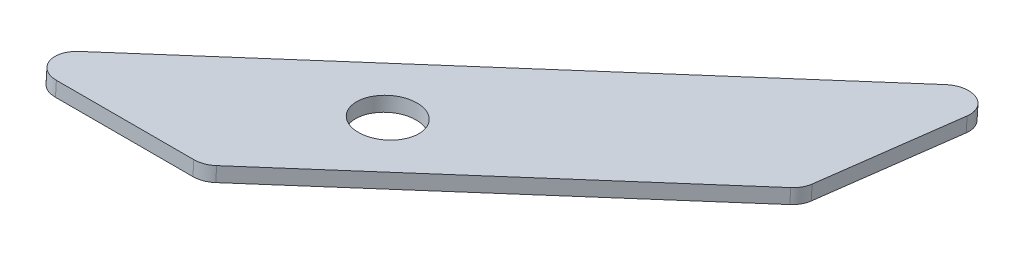
ISO-10303-21;
HEADER;
FILE_DESCRIPTION(('STEP AP214'),'2;1');
FILE_NAME('part.step','',(''),(''),'','','');
FILE_SCHEMA(('AUTOMOTIVE_DESIGN { 1 0 10303 214 1 1 1 1 }'));
ENDSEC;
DATA;
#1=APPLICATION_CONTEXT('core data for automotive mechanical design processes');
#2=APPLICATION_PROTOCOL_DEFINITION('international standard','automotive_design',2000,#1);
#3=PRODUCT_CONTEXT('',#1,'mechanical');
#4=PRODUCT('Part','Part','',(#3));
#5=PRODUCT_RELATED_PRODUCT_CATEGORY('part','',(#4));
#6=PRODUCT_DEFINITION_FORMATION('','',#4);
#7=PRODUCT_DEFINITION_CONTEXT('part definition',#1,'design');
#8=PRODUCT_DEFINITION('design','',#6,#7);
#9=PRODUCT_DEFINITION_SHAPE('','',#8);
#10=(LENGTH_UNIT() NAMED_UNIT(*) SI_UNIT(.MILLI.,.METRE.));
#11=(NAMED_UNIT(*) PLANE_ANGLE_UNIT() SI_UNIT($,.RADIAN.));
#12=(NAMED_UNIT(*) SI_UNIT($,.STERADIAN.) SOLID_ANGLE_UNIT());
#13=UNCERTAINTY_MEASURE_WITH_UNIT(LENGTH_MEASURE(1.E-05),#10,'distance_accuracy_value','');
#14=(GEOMETRIC_REPRESENTATION_CONTEXT(3) GLOBAL_UNCERTAINTY_ASSIGNED_CONTEXT((#13)) GLOBAL_UNIT_ASSIGNED_CONTEXT((#10,
#11,#12)) REPRESENTATION_CONTEXT('',''));
#15=CARTESIAN_POINT('',(0.,0.,0.));
#16=DIRECTION('',(0.,0.,1.));
#17=DIRECTION('',(1.,0.,0.));
#18=AXIS2_PLACEMENT_3D('',#15,#16,#17);
#19=CARTESIAN_POINT('',(0.,39.1342615246011,-2.55582718350822));
#20=DIRECTION('',(0.,-0.997874152520213,0.0651703593059531));
#21=DIRECTION('',(0.,-0.0651703593059531,-0.997874152520213));
#22=AXIS2_PLACEMENT_3D('',#19,#20,#21);
#23=PLANE('',#22);
#24=DIRECTION('',(0.707106781186552,-0.0460824029976039,-0.705603580017817));
#25=VECTOR('',#24,1.);
#26=CARTESIAN_POINT('',(115.342911463774,132.560980983489,1427.9734731861));
#27=LINE('',#26,#25);
#28=CARTESIAN_POINT('',(119.678962687988,132.278398967238,1423.64663974545));
#29=VERTEX_POINT('',#28);
#30=CARTESIAN_POINT('',(167.859919045252,129.13842872973,1375.56810875284));
#31=VERTEX_POINT('',#30);
#32=EDGE_CURVE('E143',#29,#31,#27,.T.);
#33=ORIENTED_EDGE('',*,*,#32,.T.);
#34=CARTESIAN_POINT('',(169.655970269466,129.255478033344,1377.36034184608));
#35=DIRECTION('',(0.,-0.997874152520213,0.0651703593059531));
#36=DIRECTION('',(0.,-0.0651703593059531,-0.997874152520213));
#37=AXIS2_PLACEMENT_3D('',#34,#35,#36);
#38=CIRCLE('',#37,2.54);
#39=CARTESIAN_POINT('',(172.191244955838,129.265570450912,1377.51487471555));
#40=VERTEX_POINT('',#39);
#41=EDGE_CURVE('E161',#31,#40,#38,.T.);
#42=ORIENTED_EDGE('',*,*,#41,.T.);
#43=DIRECTION('',(-0.0609693238726651,0.0650491189961366,0.99601774766534));
#44=VECTOR('',#43,1.);
#45=CARTESIAN_POINT('',(172.59994748384,128.829519373267,1370.83815689176));
#46=LINE('',#45,#44);
#47=CARTESIAN_POINT('',(171.198059162052,130.325215806669,1393.73993044041));
#48=VERTEX_POINT('',#47);
#49=EDGE_CURVE('E125',#40,#48,#46,.T.);
#50=ORIENTED_EDGE('',*,*,#49,.T.);
#51=CARTESIAN_POINT('',(168.662784475679,130.315123389101,1393.58539757094));
#52=DIRECTION('',(0.,-0.997874152520213,0.0651703593059531));
#53=DIRECTION('',(0.,-0.0651703593059531,-0.997874152520213));
#54=AXIS2_PLACEMENT_3D('',#51,#52,#53);
#55=CIRCLE('',#54,2.54);
#56=CARTESIAN_POINT('',(170.458835699893,130.432172692715,1395.37763066418));
#57=VERTEX_POINT('',#56);
#58=EDGE_CURVE('E158',#48,#57,#55,.T.);
#59=ORIENTED_EDGE('',*,*,#58,.T.);
#60=DIRECTION('',(-0.70710678118655,0.0460824029976047,0.705603580017819));
#61=VECTOR('',#60,1.);
#62=CARTESIAN_POINT('',(171.139380140036,130.387821367027,1394.69853295772));
#63=LINE('',#62,#61);
#64=CARTESIAN_POINT('',(138.537500542234,132.512497574465,1427.23110593194));
#65=VERTEX_POINT('',#64);
#66=EDGE_CURVE('E172',#57,#65,#63,.T.);
#67=ORIENTED_EDGE('',*,*,#66,.T.);
#68=CARTESIAN_POINT('',(136.74144931802,132.395448270851,1425.4388728387));
#69=DIRECTION('',(0.,-0.997874152520213,0.0651703593059531));
#70=DIRECTION('',(0.,-0.0651703593059531,-0.997874152520213));
#71=AXIS2_PLACEMENT_3D('',#68,#69,#70);
#72=CIRCLE('',#71,2.54);
#73=CARTESIAN_POINT('',(136.74144931802,132.560980983489,1427.9734731861));
#74=VERTEX_POINT('',#73);
#75=EDGE_CURVE('E61',#65,#74,#72,.T.);
#76=ORIENTED_EDGE('',*,*,#75,.T.);
#77=DIRECTION('',(-1.,0.,0.));
#78=VECTOR('',#77,1.);
#79=CARTESIAN_POINT('',(137.793551766447,132.560980983489,1427.9734731861));
#80=LINE('',#79,#78);
#81=CARTESIAN_POINT('',(121.475013912202,132.560980983489,1427.9734731861));
#82=VERTEX_POINT('',#81);
#83=EDGE_CURVE('E180',#74,#82,#80,.T.);
#84=ORIENTED_EDGE('',*,*,#83,.T.);
#85=CARTESIAN_POINT('',(121.475013912202,132.395448270851,1425.4388728387));
#86=DIRECTION('',(0.,-0.997874152520213,0.0651703593059531));
#87=DIRECTION('',(0.,-0.0651703593059531,-0.997874152520213));
#88=AXIS2_PLACEMENT_3D('',#85,#86,#87);
#89=CIRCLE('',#88,2.54);
#90=EDGE_CURVE('E156',#82,#29,#89,.T.);
#91=ORIENTED_EDGE('',*,*,#90,.T.);
#92=EDGE_LOOP('',(#33,#42,#50,#59,#67,#76,#84,#91));
#93=FACE_BOUND('',#92,.T.);
#94=CARTESIAN_POINT('',(142.443231615111,131.526401529507,1412.13222101484));
#95=DIRECTION('',(0.,-0.997874152520213,0.0651703593059542));
#96=DIRECTION('',(0.,-0.0651703593059542,-0.997874152520213));
#97=AXIS2_PLACEMENT_3D('',#94,#95,#96);
#98=CIRCLE('',#97,3.26389999999984);
#99=CARTESIAN_POINT('',(142.443231615111,131.313691993768,1408.87525956843));
#100=VERTEX_POINT('',#99);
#101=EDGE_CURVE('E134',#100,#100,#98,.T.);
#102=ORIENTED_EDGE('',*,*,#101,.F.);
#103=EDGE_LOOP('',(#102));
#104=FACE_BOUND('',#103,.T.);
#105=ADVANCED_FACE('F39',(#93,#104),#23,.T.);
#106=CARTESIAN_POINT('',(0.,40.7183867417269,-2.65928512890642));
#107=DIRECTION('',(0.,-0.997874152520213,0.0651703593059531));
#108=DIRECTION('',(0.,-0.0651703593059531,-0.997874152520213));
#109=AXIS2_PLACEMENT_3D('',#106,#107,#108);
#110=PLANE('',#109);
#111=DIRECTION('',(-0.0609693238726651,0.0650491189961366,0.99601774766534));
#112=VECTOR('',#111,1.);
#113=CARTESIAN_POINT('',(172.59994748384,130.413644590393,1370.73469894636));
#114=LINE('',#113,#112);
#115=CARTESIAN_POINT('',(172.191244955838,130.849695668038,1377.41141677015));
#116=VERTEX_POINT('',#115);
#117=CARTESIAN_POINT('',(171.198059162052,131.909341023795,1393.63647249501));
#118=VERTEX_POINT('',#117);
#119=EDGE_CURVE('E122',#116,#118,#114,.T.);
#120=ORIENTED_EDGE('',*,*,#119,.F.);
#121=CARTESIAN_POINT('',(169.655970269466,130.83960325047,1377.25688390068));
#122=DIRECTION('',(0.,-0.997874152520213,0.0651703593059531));
#123=DIRECTION('',(0.,-0.0651703593059531,-0.997874152520213));
#124=AXIS2_PLACEMENT_3D('',#121,#122,#123);
#125=CIRCLE('',#124,2.54);
#126=CARTESIAN_POINT('',(167.859919045252,130.722553946856,1375.46465080744));
#127=VERTEX_POINT('',#126);
#128=EDGE_CURVE('E105',#116,#127,#125,.F.);
#129=ORIENTED_EDGE('',*,*,#128,.T.);
#130=DIRECTION('',(0.707106781186552,-0.0460824029976039,-0.705603580017817));
#131=VECTOR('',#130,1.);
#132=CARTESIAN_POINT('',(115.342911463774,134.145106200614,1427.8700152407));
#133=LINE('',#132,#131);
#134=CARTESIAN_POINT('',(119.678962687988,133.862524184363,1423.54318180006));
#135=VERTEX_POINT('',#134);
#136=EDGE_CURVE('E147',#135,#127,#133,.T.);
#137=ORIENTED_EDGE('',*,*,#136,.F.);
#138=CARTESIAN_POINT('',(121.475013912202,133.979573487977,1425.3354148933));
#139=DIRECTION('',(0.,-0.997874152520213,0.0651703593059531));
#140=DIRECTION('',(0.,-0.0651703593059531,-0.997874152520213));
#141=AXIS2_PLACEMENT_3D('',#138,#139,#140);
#142=CIRCLE('',#141,2.54);
#143=CARTESIAN_POINT('',(121.475013912202,134.145106200614,1427.8700152407));
#144=VERTEX_POINT('',#143);
#145=EDGE_CURVE('E126',#135,#144,#142,.F.);
#146=ORIENTED_EDGE('',*,*,#145,.T.);
#147=DIRECTION('',(-1.,0.,0.));
#148=VECTOR('',#147,1.);
#149=CARTESIAN_POINT('',(137.793551766447,134.145106200614,1427.8700152407));
#150=LINE('',#149,#148);
#151=CARTESIAN_POINT('',(136.74144931802,134.145106200614,1427.8700152407));
#152=VERTEX_POINT('',#151);
#153=EDGE_CURVE('E137',#152,#144,#150,.T.);
#154=ORIENTED_EDGE('',*,*,#153,.F.);
#155=CARTESIAN_POINT('',(136.74144931802,133.979573487977,1425.3354148933));
#156=DIRECTION('',(0.,-0.997874152520213,0.0651703593059531));
#157=DIRECTION('',(0.,-0.0651703593059531,-0.997874152520213));
#158=AXIS2_PLACEMENT_3D('',#155,#156,#157);
#159=CIRCLE('',#158,2.54);
#160=CARTESIAN_POINT('',(138.537500542234,134.096622791591,1427.12764798655));
#161=VERTEX_POINT('',#160);
#162=EDGE_CURVE('E116',#152,#161,#159,.F.);
#163=ORIENTED_EDGE('',*,*,#162,.T.);
#164=DIRECTION('',(-0.70710678118655,0.0460824029976047,0.705603580017819));
#165=VECTOR('',#164,1.);
#166=CARTESIAN_POINT('',(171.139380140036,131.971946584153,1394.59507501232));
#167=LINE('',#166,#165);
#168=CARTESIAN_POINT('',(170.458835699893,132.016297909841,1395.27417271878));
#169=VERTEX_POINT('',#168);
#170=EDGE_CURVE('E133',#169,#161,#167,.T.);
#171=ORIENTED_EDGE('',*,*,#170,.F.);
#172=CARTESIAN_POINT('',(168.662784475679,131.899248606227,1393.48193962554));
#173=DIRECTION('',(0.,-0.997874152520213,0.0651703593059531));
#174=DIRECTION('',(0.,-0.0651703593059531,-0.997874152520213));
#175=AXIS2_PLACEMENT_3D('',#172,#173,#174);
#176=CIRCLE('',#175,2.54);
#177=EDGE_CURVE('E132',#169,#118,#176,.F.);
#178=ORIENTED_EDGE('',*,*,#177,.T.);
#179=EDGE_LOOP('',(#120,#129,#137,#146,#154,#163,#171,#178));
#180=FACE_BOUND('',#179,.T.);
#181=CARTESIAN_POINT('',(142.443231615111,133.110526746632,1412.02876306944));
#182=DIRECTION('',(0.,-0.997874152520213,0.0651703593059542));
#183=DIRECTION('',(0.,-0.0651703593059542,-0.997874152520213));
#184=AXIS2_PLACEMENT_3D('',#181,#182,#183);
#185=CIRCLE('',#184,3.26389999999984);
#186=CARTESIAN_POINT('',(142.443231615111,132.897817210894,1408.77180162303));
#187=VERTEX_POINT('',#186);
#188=EDGE_CURVE('E140',#187,#187,#185,.T.);
#189=ORIENTED_EDGE('',*,*,#188,.T.);
#190=EDGE_LOOP('',(#189));
#191=FACE_BOUND('',#190,.T.);
#192=ADVANCED_FACE('F129',(#180,#191),#110,.F.);
#193=CARTESIAN_POINT('',(172.59994748384,128.829519373267,1370.83815689176));
#194=DIRECTION('',(-0.998139640304156,-0.00397339274342267,-0.060839712389166));
#195=DIRECTION('',(-0.0608401926589762,0.,0.998147519636861));
#196=AXIS2_PLACEMENT_3D('',#193,#194,#195);
#197=PLANE('',#196);
#198=ORIENTED_EDGE('',*,*,#49,.F.);
#199=DIRECTION('',(0.,0.997874152520213,-0.0651703593059542));
#200=VECTOR('',#199,1.);
#201=CARTESIAN_POINT('',(172.191244955838,129.265570450912,1377.51487471555));
#202=LINE('',#201,#200);
#203=EDGE_CURVE('E109',#40,#116,#202,.T.);
#204=ORIENTED_EDGE('',*,*,#203,.T.);
#205=ORIENTED_EDGE('',*,*,#119,.T.);
#206=DIRECTION('',(0.,0.997874152520213,-0.0651703593059542));
#207=VECTOR('',#206,1.);
#208=CARTESIAN_POINT('',(171.198059162052,130.325215806669,1393.73993044041));
#209=LINE('',#208,#207);
#210=EDGE_CURVE('E127',#118,#48,#209,.F.);
#211=ORIENTED_EDGE('',*,*,#210,.T.);
#212=EDGE_LOOP('',(#198,#204,#205,#211));
#213=FACE_BOUND('',#212,.T.);
#214=ADVANCED_FACE('F121',(#213),#197,.F.);
#215=CARTESIAN_POINT('',(171.139380140036,130.387821367027,1394.69853295772));
#216=DIRECTION('',(-0.707106781186545,-0.0460824029976042,-0.705603580017824));
#217=DIRECTION('',(-0.706353980986723,0.,0.70785878079191));
#218=AXIS2_PLACEMENT_3D('',#215,#216,#217);
#219=PLANE('',#218);
#220=ORIENTED_EDGE('',*,*,#170,.T.);
#221=DIRECTION('',(0.,0.997874152520213,-0.0651703593059542));
#222=VECTOR('',#221,1.);
#223=CARTESIAN_POINT('',(138.537500542234,132.512497574465,1427.23110593194));
#224=LINE('',#223,#222);
#225=EDGE_CURVE('E11',#161,#65,#224,.F.);
#226=ORIENTED_EDGE('',*,*,#225,.T.);
#227=ORIENTED_EDGE('',*,*,#66,.F.);
#228=DIRECTION('',(0.,0.997874152520213,-0.0651703593059542));
#229=VECTOR('',#228,1.);
#230=CARTESIAN_POINT('',(170.458835699893,130.432172692715,1395.37763066418));
#231=LINE('',#230,#229);
#232=EDGE_CURVE('E47',#57,#169,#231,.T.);
#233=ORIENTED_EDGE('',*,*,#232,.T.);
#234=EDGE_LOOP('',(#220,#226,#227,#233));
#235=FACE_BOUND('',#234,.T.);
#236=ADVANCED_FACE('F170',(#235),#219,.F.);
#237=CARTESIAN_POINT('',(137.793551766447,132.560980983489,1427.9734731861));
#238=DIRECTION('',(0.,-0.0651703593059542,-0.997874152520213));
#239=DIRECTION('',(0.,0.997874152520213,-0.0651703593059542));
#240=AXIS2_PLACEMENT_3D('',#237,#238,#239);
#241=PLANE('',#240);
#242=ORIENTED_EDGE('',*,*,#83,.F.);
#243=DIRECTION('',(0.,0.997874152520213,-0.0651703593059542));
#244=VECTOR('',#243,1.);
#245=CARTESIAN_POINT('',(136.74144931802,132.560980983489,1427.9734731861));
#246=LINE('',#245,#244);
#247=EDGE_CURVE('E164',#74,#152,#246,.T.);
#248=ORIENTED_EDGE('',*,*,#247,.T.);
#249=ORIENTED_EDGE('',*,*,#153,.T.);
#250=DIRECTION('',(0.,0.997874152520213,-0.0651703593059542));
#251=VECTOR('',#250,1.);
#252=CARTESIAN_POINT('',(121.475013912202,132.560980983489,1427.9734731861));
#253=LINE('',#252,#251);
#254=EDGE_CURVE('E54',#144,#82,#253,.F.);
#255=ORIENTED_EDGE('',*,*,#254,.T.);
#256=EDGE_LOOP('',(#242,#248,#249,#255));
#257=FACE_BOUND('',#256,.T.);
#258=ADVANCED_FACE('F179',(#257),#241,.F.);
#259=CARTESIAN_POINT('',(115.342911463774,132.560980983489,1427.9734731861));
#260=DIRECTION('',(0.707106781186543,0.0460824029976043,0.705603580017826));
#261=DIRECTION('',(0.706353980986725,0.,-0.707858780791907));
#262=AXIS2_PLACEMENT_3D('',#259,#260,#261);
#263=PLANE('',#262);
#264=ORIENTED_EDGE('',*,*,#136,.T.);
#265=DIRECTION('',(0.,0.997874152520213,-0.0651703593059542));
#266=VECTOR('',#265,1.);
#267=CARTESIAN_POINT('',(167.859919045252,129.13842872973,1375.56810875284));
#268=LINE('',#267,#266);
#269=EDGE_CURVE('E110',#127,#31,#268,.F.);
#270=ORIENTED_EDGE('',*,*,#269,.T.);
#271=ORIENTED_EDGE('',*,*,#32,.F.);
#272=DIRECTION('',(0.,0.997874152520213,-0.0651703593059542));
#273=VECTOR('',#272,1.);
#274=CARTESIAN_POINT('',(119.678962687988,132.278398967238,1423.64663974545));
#275=LINE('',#274,#273);
#276=EDGE_CURVE('E115',#29,#135,#275,.T.);
#277=ORIENTED_EDGE('',*,*,#276,.T.);
#278=EDGE_LOOP('',(#264,#270,#271,#277));
#279=FACE_BOUND('',#278,.T.);
#280=ADVANCED_FACE('F191',(#279),#263,.F.);
#281=CARTESIAN_POINT('',(142.443231615111,131.526401529507,1412.13222101484));
#282=DIRECTION('',(0.,0.997874152520213,-0.0651703593059542));
#283=DIRECTION('',(0.,0.0651703593059542,0.997874152520213));
#284=AXIS2_PLACEMENT_3D('',#281,#282,#283);
#285=CYLINDRICAL_SURFACE('',#284,3.26389999999984);
#286=ORIENTED_EDGE('',*,*,#101,.T.);
#287=EDGE_LOOP('',(#286));
#288=FACE_BOUND('',#287,.T.);
#289=ORIENTED_EDGE('',*,*,#188,.F.);
#290=EDGE_LOOP('',(#289));
#291=FACE_BOUND('',#290,.T.);
#292=ADVANCED_FACE('F189',(#288,#291),#285,.F.);
#293=CARTESIAN_POINT('',(169.655970269466,129.255478033344,1377.36034184608));
#294=DIRECTION('',(0.,0.997874152520213,-0.0651703593059542));
#295=DIRECTION('',(0.,0.0651703593059542,0.997874152520213));
#296=AXIS2_PLACEMENT_3D('',#293,#294,#295);
#297=CYLINDRICAL_SURFACE('',#296,2.54);
#298=ORIENTED_EDGE('',*,*,#41,.F.);
#299=ORIENTED_EDGE('',*,*,#269,.F.);
#300=ORIENTED_EDGE('',*,*,#128,.F.);
#301=ORIENTED_EDGE('',*,*,#203,.F.);
#302=EDGE_LOOP('',(#298,#299,#300,#301));
#303=FACE_BOUND('',#302,.T.);
#304=ADVANCED_FACE('F108',(#303),#297,.T.);
#305=CARTESIAN_POINT('',(136.74144931802,132.395448270851,1425.4388728387));
#306=DIRECTION('',(0.,0.997874152520213,-0.0651703593059541));
#307=DIRECTION('',(0.,0.0651703593059542,0.997874152520213));
#308=AXIS2_PLACEMENT_3D('',#305,#306,#307);
#309=CYLINDRICAL_SURFACE('',#308,2.54);
#310=ORIENTED_EDGE('',*,*,#75,.F.);
#311=ORIENTED_EDGE('',*,*,#225,.F.);
#312=ORIENTED_EDGE('',*,*,#162,.F.);
#313=ORIENTED_EDGE('',*,*,#247,.F.);
#314=EDGE_LOOP('',(#310,#311,#312,#313));
#315=FACE_BOUND('',#314,.T.);
#316=ADVANCED_FACE('F178',(#315),#309,.T.);
#317=CARTESIAN_POINT('',(168.662784475679,130.315123389101,1393.58539757094));
#318=DIRECTION('',(0.,0.997874152520213,-0.0651703593059542));
#319=DIRECTION('',(0.,0.0651703593059542,0.997874152520213));
#320=AXIS2_PLACEMENT_3D('',#317,#318,#319);
#321=CYLINDRICAL_SURFACE('',#320,2.54);
#322=ORIENTED_EDGE('',*,*,#58,.F.);
#323=ORIENTED_EDGE('',*,*,#210,.F.);
#324=ORIENTED_EDGE('',*,*,#177,.F.);
#325=ORIENTED_EDGE('',*,*,#232,.F.);
#326=EDGE_LOOP('',(#322,#323,#324,#325));
#327=FACE_BOUND('',#326,.T.);
#328=ADVANCED_FACE('F216',(#327),#321,.T.);
#329=CARTESIAN_POINT('',(121.475013912202,132.395448270851,1425.4388728387));
#330=DIRECTION('',(0.,0.997874152520213,-0.0651703593059541));
#331=DIRECTION('',(0.,0.0651703593059542,0.997874152520213));
#332=AXIS2_PLACEMENT_3D('',#329,#330,#331);
#333=CYLINDRICAL_SURFACE('',#332,2.54);
#334=ORIENTED_EDGE('',*,*,#90,.F.);
#335=ORIENTED_EDGE('',*,*,#254,.F.);
#336=ORIENTED_EDGE('',*,*,#145,.F.);
#337=ORIENTED_EDGE('',*,*,#276,.F.);
#338=EDGE_LOOP('',(#334,#335,#336,#337));
#339=FACE_BOUND('',#338,.T.);
#340=ADVANCED_FACE('F41',(#339),#333,.T.);
#341=CLOSED_SHELL('',(#105,#192,#214,#236,#258,#280,#292,#304,#316,#328,#340));
#342=MANIFOLD_SOLID_BREP('B2',#341);
#343=ADVANCED_BREP_SHAPE_REPRESENTATION('',(#18,#342),#14);
#344=SHAPE_DEFINITION_REPRESENTATION(#9,#343);
ENDSEC;
END-ISO-10303-21;
